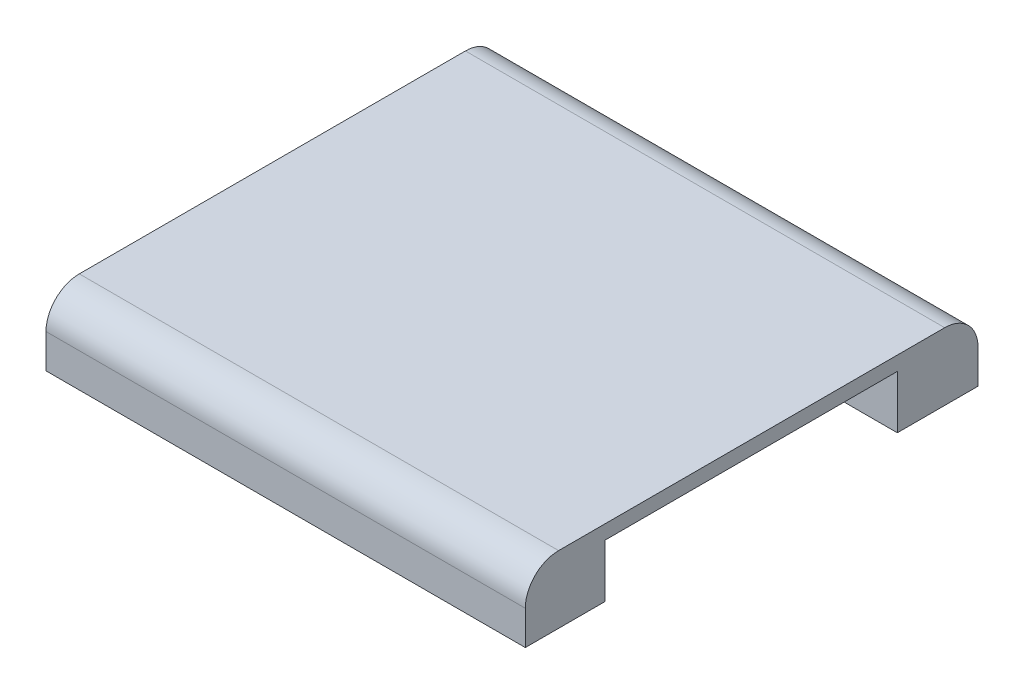
ISO-10303-21;
HEADER;
FILE_DESCRIPTION(('STEP AP214'),'2;1');
FILE_NAME('part.step','',(''),(''),'','','');
FILE_SCHEMA(('AUTOMOTIVE_DESIGN { 1 0 10303 214 1 1 1 1 }'));
ENDSEC;
DATA;
#1=APPLICATION_CONTEXT('core data for automotive mechanical design processes');
#2=APPLICATION_PROTOCOL_DEFINITION('international standard','automotive_design',2000,#1);
#3=PRODUCT_CONTEXT('',#1,'mechanical');
#4=PRODUCT('Part','Part','',(#3));
#5=PRODUCT_RELATED_PRODUCT_CATEGORY('part','',(#4));
#6=PRODUCT_DEFINITION_FORMATION('','',#4);
#7=PRODUCT_DEFINITION_CONTEXT('part definition',#1,'design');
#8=PRODUCT_DEFINITION('design','',#6,#7);
#9=PRODUCT_DEFINITION_SHAPE('','',#8);
#10=(LENGTH_UNIT() NAMED_UNIT(*) SI_UNIT(.MILLI.,.METRE.));
#11=(NAMED_UNIT(*) PLANE_ANGLE_UNIT() SI_UNIT($,.RADIAN.));
#12=(NAMED_UNIT(*) SI_UNIT($,.STERADIAN.) SOLID_ANGLE_UNIT());
#13=UNCERTAINTY_MEASURE_WITH_UNIT(LENGTH_MEASURE(1.E-05),#10,'distance_accuracy_value','');
#14=(GEOMETRIC_REPRESENTATION_CONTEXT(3) GLOBAL_UNCERTAINTY_ASSIGNED_CONTEXT((#13)) GLOBAL_UNIT_ASSIGNED_CONTEXT((#10,
#11,#12)) REPRESENTATION_CONTEXT('',''));
#15=CARTESIAN_POINT('',(0.,0.,0.));
#16=DIRECTION('',(0.,0.,1.));
#17=DIRECTION('',(1.,0.,0.));
#18=AXIS2_PLACEMENT_3D('',#15,#16,#17);
#19=CARTESIAN_POINT('',(0.,0.,1.));
#20=DIRECTION('',(0.,0.,1.));
#21=DIRECTION('',(1.,0.,0.));
#22=AXIS2_PLACEMENT_3D('',#19,#20,#21);
#23=PLANE('',#22);
#24=DIRECTION('',(-1.,0.,0.));
#25=VECTOR('',#24,1.);
#26=CARTESIAN_POINT('',(0.,-0.0578125220072959,1.));
#27=LINE('',#26,#25);
#28=CARTESIAN_POINT('',(17.,-0.0578125220072959,1.));
#29=VERTEX_POINT('',#28);
#30=CARTESIAN_POINT('',(2.52238131463829,-0.0578125220072959,1.));
#31=VERTEX_POINT('',#30);
#32=EDGE_CURVE('E443',#29,#31,#27,.T.);
#33=ORIENTED_EDGE('',*,*,#32,.F.);
#34=DIRECTION('',(0.,1.,0.));
#35=VECTOR('',#34,1.);
#36=CARTESIAN_POINT('',(17.,-5.,1.));
#37=LINE('',#36,#35);
#38=CARTESIAN_POINT('',(17.,4.,1.));
#39=VERTEX_POINT('',#38);
#40=EDGE_CURVE('E331',#29,#39,#37,.T.);
#41=ORIENTED_EDGE('',*,*,#40,.T.);
#42=DIRECTION('',(1.,0.,0.));
#43=VECTOR('',#42,1.);
#44=CARTESIAN_POINT('',(-18.,4.,1.));
#45=LINE('',#44,#43);
#46=CARTESIAN_POINT('',(2.52238131463829,4.,1.));
#47=VERTEX_POINT('',#46);
#48=EDGE_CURVE('E327',#47,#39,#45,.T.);
#49=ORIENTED_EDGE('',*,*,#48,.F.);
#50=DIRECTION('',(0.,1.,0.));
#51=VECTOR('',#50,1.);
#52=CARTESIAN_POINT('',(2.52238131463829,0.,1.));
#53=LINE('',#52,#51);
#54=EDGE_CURVE('E384',#31,#47,#53,.T.);
#55=ORIENTED_EDGE('',*,*,#54,.F.);
#56=EDGE_LOOP('',(#33,#41,#49,#55));
#57=FACE_BOUND('',#56,.T.);
#58=ADVANCED_FACE('F34',(#57),#23,.T.);
#59=CARTESIAN_POINT('',(2.54458171045212,-3.2,0.980815803191426));
#60=DIRECTION('',(0.653837073445968,0.,0.756635368845266));
#61=DIRECTION('',(0.756635368845266,0.,-0.653837073445968));
#62=AXIS2_PLACEMENT_3D('',#59,#60,#61);
#63=PLANE('',#62);
#64=DIRECTION('',(-0.756635368845266,0.,0.653837073445968));
#65=VECTOR('',#64,1.);
#66=CARTESIAN_POINT('',(2.54458171045212,-0.0578125220072959,0.980815803191426));
#67=LINE('',#66,#65);
#68=CARTESIAN_POINT('',(-0.105019187153202,-0.0578125220072959,3.27043556988826));
#69=VERTEX_POINT('',#68);
#70=EDGE_CURVE('E410',#31,#69,#67,.T.);
#71=ORIENTED_EDGE('',*,*,#70,.F.);
#72=ORIENTED_EDGE('',*,*,#54,.T.);
#73=DIRECTION('',(0.756635368845266,0.,-0.653837073445968));
#74=VECTOR('',#73,1.);
#75=CARTESIAN_POINT('',(2.54458171045212,4.,0.980815803191426));
#76=LINE('',#75,#74);
#77=CARTESIAN_POINT('',(-0.105019187153202,4.,3.27043556988826));
#78=VERTEX_POINT('',#77);
#79=EDGE_CURVE('E283',#78,#47,#76,.T.);
#80=ORIENTED_EDGE('',*,*,#79,.F.);
#81=DIRECTION('',(0.,1.,0.));
#82=VECTOR('',#81,1.);
#83=CARTESIAN_POINT('',(-0.105019187153202,-3.2,3.27043556988826));
#84=LINE('',#83,#82);
#85=EDGE_CURVE('E293',#69,#78,#84,.T.);
#86=ORIENTED_EDGE('',*,*,#85,.F.);
#87=EDGE_LOOP('',(#71,#72,#80,#86));
#88=FACE_BOUND('',#87,.T.);
#89=ADVANCED_FACE('F478',(#88),#63,.T.);
#90=DIRECTION('',(-1.,0.,0.));
#91=VECTOR('',#90,1.);
#92=CARTESIAN_POINT('',(0.,-0.0578125220072959,1.));
#93=LINE('',#92,#91);
#94=CARTESIAN_POINT('',(-5.64547851523037,-0.0578125220072959,1.));
#95=VERTEX_POINT('',#94);
#96=CARTESIAN_POINT('',(-17.,-0.0578125220072959,1.));
#97=VERTEX_POINT('',#96);
#98=EDGE_CURVE('E432',#95,#97,#93,.T.);
#99=ORIENTED_EDGE('',*,*,#98,.F.);
#100=DIRECTION('',(0.,-1.,0.));
#101=VECTOR('',#100,1.);
#102=CARTESIAN_POINT('',(-5.64547851523037,0.,1.));
#103=LINE('',#102,#101);
#104=CARTESIAN_POINT('',(-5.64547851523037,4.,1.));
#105=VERTEX_POINT('',#104);
#106=EDGE_CURVE('E381',#105,#95,#103,.T.);
#107=ORIENTED_EDGE('',*,*,#106,.F.);
#108=CARTESIAN_POINT('',(-17.,4.,1.));
#109=VERTEX_POINT('',#108);
#110=EDGE_CURVE('E328',#109,#105,#45,.T.);
#111=ORIENTED_EDGE('',*,*,#110,.F.);
#112=DIRECTION('',(0.,1.,0.));
#113=VECTOR('',#112,1.);
#114=CARTESIAN_POINT('',(-17.,-5.,1.));
#115=LINE('',#114,#113);
#116=EDGE_CURVE('E346',#97,#109,#115,.T.);
#117=ORIENTED_EDGE('',*,*,#116,.F.);
#118=EDGE_LOOP('',(#99,#107,#111,#117));
#119=FACE_BOUND('',#118,.T.);
#120=ADVANCED_FACE('F453',(#119),#23,.T.);
#121=CARTESIAN_POINT('',(-18.,4.,34.));
#122=DIRECTION('',(0.,1.,0.));
#123=DIRECTION('',(0.,0.,1.));
#124=AXIS2_PLACEMENT_3D('',#121,#122,#123);
#125=PLANE('',#124);
#126=DIRECTION('',(1.,0.,0.));
#127=VECTOR('',#126,1.);
#128=CARTESIAN_POINT('',(-0.105019187153202,4.,3.27043556988826));
#129=LINE('',#128,#127);
#130=CARTESIAN_POINT('',(-3.68350976570056,4.,3.27043556988826));
#131=VERTEX_POINT('',#130);
#132=EDGE_CURVE('E284',#131,#78,#129,.T.);
#133=ORIENTED_EDGE('',*,*,#132,.T.);
#134=ORIENTED_EDGE('',*,*,#79,.T.);
#135=ORIENTED_EDGE('',*,*,#48,.T.);
#136=DIRECTION('',(0.,0.,-1.));
#137=VECTOR('',#136,1.);
#138=CARTESIAN_POINT('',(17.,4.,34.));
#139=LINE('',#138,#137);
#140=CARTESIAN_POINT('',(17.,4.,4.95785802597595));
#141=VERTEX_POINT('',#140);
#142=EDGE_CURVE('E345',#141,#39,#139,.T.);
#143=ORIENTED_EDGE('',*,*,#142,.F.);
#144=DIRECTION('',(1.,0.,0.));
#145=VECTOR('',#144,1.);
#146=CARTESIAN_POINT('',(-18.,4.,4.95785802597595));
#147=LINE('',#146,#145);
#148=CARTESIAN_POINT('',(-17.,4.,4.95785802597595));
#149=VERTEX_POINT('',#148);
#150=EDGE_CURVE('E317',#149,#141,#147,.T.);
#151=ORIENTED_EDGE('',*,*,#150,.F.);
#152=DIRECTION('',(0.,0.,-1.));
#153=VECTOR('',#152,1.);
#154=CARTESIAN_POINT('',(-17.,4.,34.));
#155=LINE('',#154,#153);
#156=EDGE_CURVE('E336',#149,#109,#155,.T.);
#157=ORIENTED_EDGE('',*,*,#156,.T.);
#158=ORIENTED_EDGE('',*,*,#110,.T.);
#159=DIRECTION('',(0.653837073445968,0.,0.756635368845266));
#160=VECTOR('',#159,1.);
#161=CARTESIAN_POINT('',(-3.68350976570056,4.,3.27043556988826));
#162=LINE('',#161,#160);
#163=EDGE_CURVE('E288',#105,#131,#162,.T.);
#164=ORIENTED_EDGE('',*,*,#163,.T.);
#165=EDGE_LOOP('',(#133,#134,#135,#143,#151,#157,#158,#164));
#166=FACE_BOUND('',#165,.T.);
#167=ADVANCED_FACE('F461',(#166),#125,.F.);
#168=CARTESIAN_POINT('',(-0.105019187153202,-3.2,3.27043556988826));
#169=DIRECTION('',(0.,0.,1.));
#170=DIRECTION('',(1.,0.,0.));
#171=AXIS2_PLACEMENT_3D('',#168,#169,#170);
#172=PLANE('',#171);
#173=DIRECTION('',(-1.,0.,0.));
#174=VECTOR('',#173,1.);
#175=CARTESIAN_POINT('',(-0.105019187153202,-0.0578125220072959,3.27043556988826));
#176=LINE('',#175,#174);
#177=CARTESIAN_POINT('',(-3.68350976570056,-0.0578125220072959,3.27043556988826));
#178=VERTEX_POINT('',#177);
#179=EDGE_CURVE('E438',#69,#178,#176,.T.);
#180=ORIENTED_EDGE('',*,*,#179,.F.);
#181=ORIENTED_EDGE('',*,*,#85,.T.);
#182=ORIENTED_EDGE('',*,*,#132,.F.);
#183=DIRECTION('',(0.,1.,0.));
#184=VECTOR('',#183,1.);
#185=CARTESIAN_POINT('',(-3.68350976570056,-3.2,3.27043556988826));
#186=LINE('',#185,#184);
#187=EDGE_CURVE('E287',#178,#131,#186,.T.);
#188=ORIENTED_EDGE('',*,*,#187,.F.);
#189=EDGE_LOOP('',(#180,#181,#182,#188));
#190=FACE_BOUND('',#189,.T.);
#191=ADVANCED_FACE('F481',(#190),#172,.T.);
#192=CARTESIAN_POINT('',(-3.68350976570056,-3.2,3.27043556988826));
#193=DIRECTION('',(-0.756635368845266,0.,0.653837073445968));
#194=DIRECTION('',(0.653837073445968,0.,0.756635368845266));
#195=AXIS2_PLACEMENT_3D('',#192,#193,#194);
#196=PLANE('',#195);
#197=DIRECTION('',(-0.653837073445968,0.,-0.756635368845266));
#198=VECTOR('',#197,1.);
#199=CARTESIAN_POINT('',(-3.68350976570056,-0.0578125220072959,3.27043556988826));
#200=LINE('',#199,#198);
#201=EDGE_CURVE('E43',#178,#95,#200,.T.);
#202=ORIENTED_EDGE('',*,*,#201,.F.);
#203=ORIENTED_EDGE('',*,*,#187,.T.);
#204=ORIENTED_EDGE('',*,*,#163,.F.);
#205=ORIENTED_EDGE('',*,*,#106,.T.);
#206=EDGE_LOOP('',(#202,#203,#204,#205));
#207=FACE_BOUND('',#206,.T.);
#208=ADVANCED_FACE('F483',(#207),#196,.T.);
#209=CARTESIAN_POINT('',(-17.,-5.,34.));
#210=DIRECTION('',(-1.,0.,0.));
#211=DIRECTION('',(0.,-1.,0.));
#212=AXIS2_PLACEMENT_3D('',#209,#210,#211);
#213=PLANE('',#212);
#214=DIRECTION('',(0.,1.,0.));
#215=VECTOR('',#214,1.);
#216=CARTESIAN_POINT('',(-17.,-5.,4.95785802597595));
#217=LINE('',#216,#215);
#218=CARTESIAN_POINT('',(-17.,-0.0578125220072959,4.95785802597595));
#219=VERTEX_POINT('',#218);
#220=EDGE_CURVE('E320',#219,#149,#217,.T.);
#221=ORIENTED_EDGE('',*,*,#220,.F.);
#222=DIRECTION('',(0.,0.,-1.));
#223=VECTOR('',#222,1.);
#224=CARTESIAN_POINT('',(-17.,-0.0578125220072959,34.));
#225=LINE('',#224,#223);
#226=EDGE_CURVE('E408',#219,#97,#225,.T.);
#227=ORIENTED_EDGE('',*,*,#226,.T.);
#228=ORIENTED_EDGE('',*,*,#116,.T.);
#229=ORIENTED_EDGE('',*,*,#156,.F.);
#230=EDGE_LOOP('',(#221,#227,#228,#229));
#231=FACE_BOUND('',#230,.T.);
#232=ADVANCED_FACE('F458',(#231),#213,.F.);
#233=CARTESIAN_POINT('',(17.,-5.,34.));
#234=DIRECTION('',(-1.,0.,0.));
#235=DIRECTION('',(0.,0.,1.));
#236=AXIS2_PLACEMENT_3D('',#233,#234,#235);
#237=PLANE('',#236);
#238=DIRECTION('',(0.,0.,-1.));
#239=VECTOR('',#238,1.);
#240=CARTESIAN_POINT('',(17.,-0.0578125220072959,34.));
#241=LINE('',#240,#239);
#242=CARTESIAN_POINT('',(17.,-0.0578125220072959,4.95785802597595));
#243=VERTEX_POINT('',#242);
#244=EDGE_CURVE('E429',#243,#29,#241,.T.);
#245=ORIENTED_EDGE('',*,*,#244,.F.);
#246=DIRECTION('',(0.,1.,0.));
#247=VECTOR('',#246,1.);
#248=CARTESIAN_POINT('',(17.,-5.,4.95785802597595));
#249=LINE('',#248,#247);
#250=EDGE_CURVE('E363',#243,#141,#249,.T.);
#251=ORIENTED_EDGE('',*,*,#250,.T.);
#252=ORIENTED_EDGE('',*,*,#142,.T.);
#253=ORIENTED_EDGE('',*,*,#40,.F.);
#254=EDGE_LOOP('',(#245,#251,#252,#253));
#255=FACE_BOUND('',#254,.T.);
#256=ADVANCED_FACE('F471',(#255),#237,.T.);
#257=CARTESIAN_POINT('',(42.7067172059882,4.9358262277073,4.95785802597595));
#258=DIRECTION('',(0.,0.,1.));
#259=DIRECTION('',(1.,0.,0.));
#260=AXIS2_PLACEMENT_3D('',#257,#258,#259);
#261=PLANE('',#260);
#262=ORIENTED_EDGE('',*,*,#250,.F.);
#263=DIRECTION('',(-1.,0.,0.));
#264=VECTOR('',#263,1.);
#265=CARTESIAN_POINT('',(42.7067172059882,-0.0578125220072959,4.95785802597595));
#266=LINE('',#265,#264);
#267=EDGE_CURVE('E38',#243,#219,#266,.T.);
#268=ORIENTED_EDGE('',*,*,#267,.T.);
#269=ORIENTED_EDGE('',*,*,#220,.T.);
#270=ORIENTED_EDGE('',*,*,#150,.T.);
#271=EDGE_LOOP('',(#262,#268,#269,#270));
#272=FACE_BOUND('',#271,.T.);
#273=ADVANCED_FACE('F467',(#272),#261,.F.);
#274=CARTESIAN_POINT('',(18.,-0.0578125220072959,28.0241501159373));
#275=DIRECTION('',(0.,1.,0.));
#276=DIRECTION('',(0.,0.,1.));
#277=AXIS2_PLACEMENT_3D('',#274,#275,#276);
#278=PLANE('',#277);
#279=DIRECTION('',(1.,0.,0.));
#280=VECTOR('',#279,1.);
#281=CARTESIAN_POINT('',(-40.325568237644,-0.0578125220072959,6.05869530103713));
#282=LINE('',#281,#280);
#283=CARTESIAN_POINT('',(-18.,-0.0578125220072959,6.05869530103713));
#284=VERTEX_POINT('',#283);
#285=CARTESIAN_POINT('',(18.,-0.0578125220072959,6.05869530103713));
#286=VERTEX_POINT('',#285);
#287=EDGE_CURVE('E252',#284,#286,#282,.T.);
#288=ORIENTED_EDGE('',*,*,#287,.F.);
#289=DIRECTION('',(0.,0.,-1.));
#290=VECTOR('',#289,1.);
#291=CARTESIAN_POINT('',(-18.,-0.0578125220072959,34.));
#292=LINE('',#291,#290);
#293=CARTESIAN_POINT('',(-18.,-0.0578125220072959,0.));
#294=VERTEX_POINT('',#293);
#295=EDGE_CURVE('E398',#284,#294,#292,.T.);
#296=ORIENTED_EDGE('',*,*,#295,.T.);
#297=DIRECTION('',(-1.,0.,0.));
#298=VECTOR('',#297,1.);
#299=CARTESIAN_POINT('',(0.,-0.0578125220072959,0.));
#300=LINE('',#299,#298);
#301=CARTESIAN_POINT('',(18.,-0.0578125220072959,0.));
#302=VERTEX_POINT('',#301);
#303=EDGE_CURVE('E403',#302,#294,#300,.T.);
#304=ORIENTED_EDGE('',*,*,#303,.F.);
#305=DIRECTION('',(0.,0.,-1.));
#306=VECTOR('',#305,1.);
#307=CARTESIAN_POINT('',(18.,-0.0578125220072959,34.));
#308=LINE('',#307,#306);
#309=EDGE_CURVE('E405',#286,#302,#308,.T.);
#310=ORIENTED_EDGE('',*,*,#309,.F.);
#311=EDGE_LOOP('',(#288,#296,#304,#310));
#312=FACE_BOUND('',#311,.T.);
#313=ORIENTED_EDGE('',*,*,#267,.F.);
#314=ORIENTED_EDGE('',*,*,#244,.T.);
#315=ORIENTED_EDGE('',*,*,#32,.T.);
#316=ORIENTED_EDGE('',*,*,#70,.T.);
#317=ORIENTED_EDGE('',*,*,#179,.T.);
#318=ORIENTED_EDGE('',*,*,#201,.T.);
#319=ORIENTED_EDGE('',*,*,#98,.T.);
#320=ORIENTED_EDGE('',*,*,#226,.F.);
#321=EDGE_LOOP('',(#313,#314,#315,#316,#317,#318,#319,#320));
#322=FACE_BOUND('',#321,.T.);
#323=ADVANCED_FACE('F36',(#312,#322),#278,.F.);
#324=CARTESIAN_POINT('',(-18.,-0.0578125220072959,34.));
#325=VERTEX_POINT('',#324);
#326=CARTESIAN_POINT('',(-18.,-0.0578125220072959,28.0241501159373));
#327=VERTEX_POINT('',#326);
#328=EDGE_CURVE('E402',#325,#327,#292,.T.);
#329=ORIENTED_EDGE('',*,*,#328,.T.);
#330=DIRECTION('',(1.,0.,0.));
#331=VECTOR('',#330,1.);
#332=CARTESIAN_POINT('',(-40.325568237644,-0.0578125220072959,28.0241501159373));
#333=LINE('',#332,#331);
#334=CARTESIAN_POINT('',(18.,-0.0578125220072959,28.0241501159373));
#335=VERTEX_POINT('',#334);
#336=EDGE_CURVE('E11',#327,#335,#333,.T.);
#337=ORIENTED_EDGE('',*,*,#336,.T.);
#338=CARTESIAN_POINT('',(18.,-0.0578125220072959,34.));
#339=VERTEX_POINT('',#338);
#340=EDGE_CURVE('E51',#339,#335,#308,.T.);
#341=ORIENTED_EDGE('',*,*,#340,.F.);
#342=DIRECTION('',(-1.,0.,0.));
#343=VECTOR('',#342,1.);
#344=CARTESIAN_POINT('',(0.,-0.0578125220072959,34.));
#345=LINE('',#344,#343);
#346=EDGE_CURVE('E401',#339,#325,#345,.T.);
#347=ORIENTED_EDGE('',*,*,#346,.T.);
#348=EDGE_LOOP('',(#329,#337,#341,#347));
#349=FACE_BOUND('',#348,.T.);
#350=CARTESIAN_POINT('',(17.,-0.0578125220072959,33.));
#351=VERTEX_POINT('',#350);
#352=CARTESIAN_POINT('',(17.,-0.0578125220072959,28.926894451086));
#353=VERTEX_POINT('',#352);
#354=EDGE_CURVE('E433',#351,#353,#241,.T.);
#355=ORIENTED_EDGE('',*,*,#354,.T.);
#356=DIRECTION('',(1.,0.,0.));
#357=VECTOR('',#356,1.);
#358=CARTESIAN_POINT('',(42.7067172059882,-0.0578125220072959,28.926894451086));
#359=LINE('',#358,#357);
#360=CARTESIAN_POINT('',(-17.,-0.0578125220072959,28.926894451086));
#361=VERTEX_POINT('',#360);
#362=EDGE_CURVE('E406',#361,#353,#359,.T.);
#363=ORIENTED_EDGE('',*,*,#362,.F.);
#364=CARTESIAN_POINT('',(-17.,-0.0578125220072959,33.));
#365=VERTEX_POINT('',#364);
#366=EDGE_CURVE('E416',#365,#361,#225,.T.);
#367=ORIENTED_EDGE('',*,*,#366,.F.);
#368=DIRECTION('',(-1.,0.,0.));
#369=VECTOR('',#368,1.);
#370=CARTESIAN_POINT('',(0.,-0.0578125220072959,33.));
#371=LINE('',#370,#369);
#372=CARTESIAN_POINT('',(7.80627689891058,-0.0578125220072959,33.));
#373=VERTEX_POINT('',#372);
#374=EDGE_CURVE('E417',#373,#365,#371,.T.);
#375=ORIENTED_EDGE('',*,*,#374,.F.);
#376=DIRECTION('',(-0.707040858821482,0.,0.707172697406356));
#377=VECTOR('',#376,1.);
#378=CARTESIAN_POINT('',(7.80627689891058,-0.0578125220072959,33.));
#379=LINE('',#378,#377);
#380=CARTESIAN_POINT('',(7.83796469042223,-0.0578125220072959,32.9683062998148));
#381=VERTEX_POINT('',#380);
#382=EDGE_CURVE('E397',#381,#373,#379,.T.);
#383=ORIENTED_EDGE('',*,*,#382,.F.);
#384=DIRECTION('',(1.,0.,0.));
#385=VECTOR('',#384,1.);
#386=CARTESIAN_POINT('',(13.9400122350262,-0.0578125220072959,32.9683062998148));
#387=LINE('',#386,#385);
#388=CARTESIAN_POINT('',(4.85968181109299,-0.0578125220072959,32.9683062998148));
#389=VERTEX_POINT('',#388);
#390=EDGE_CURVE('E413',#389,#381,#387,.T.);
#391=ORIENTED_EDGE('',*,*,#390,.F.);
#392=DIRECTION('',(-0.68267317744641,0.,0.73072384167702));
#393=VECTOR('',#392,1.);
#394=CARTESIAN_POINT('',(4.85968181109299,-0.0578125220072959,32.9683062998148));
#395=LINE('',#394,#393);
#396=CARTESIAN_POINT('',(7.40340874838498,-0.0578125220072959,30.2455364866692));
#397=VERTEX_POINT('',#396);
#398=EDGE_CURVE('E420',#397,#389,#395,.T.);
#399=ORIENTED_EDGE('',*,*,#398,.F.);
#400=DIRECTION('',(-1.,0.,0.));
#401=VECTOR('',#400,1.);
#402=CARTESIAN_POINT('',(12.3591776077276,-0.0578125220072959,30.2455364866692));
#403=LINE('',#402,#401);
#404=CARTESIAN_POINT('',(13.9400122350262,-0.0578125220072959,30.2455364866692));
#405=VERTEX_POINT('',#404);
#406=EDGE_CURVE('E423',#405,#397,#403,.T.);
#407=ORIENTED_EDGE('',*,*,#406,.F.);
#408=DIRECTION('',(0.,0.,-1.));
#409=VECTOR('',#408,1.);
#410=CARTESIAN_POINT('',(13.9400122350262,-0.0578125220072959,30.2455364866692));
#411=LINE('',#410,#409);
#412=CARTESIAN_POINT('',(13.9400122350262,-0.0578125220072959,32.9683062998148));
#413=VERTEX_POINT('',#412);
#414=EDGE_CURVE('E422',#413,#405,#411,.T.);
#415=ORIENTED_EDGE('',*,*,#414,.F.);
#416=DIRECTION('',(1.,0.,0.));
#417=VECTOR('',#416,1.);
#418=CARTESIAN_POINT('',(13.9400122350262,-0.0578125220072959,32.9683062998148));
#419=LINE('',#418,#417);
#420=CARTESIAN_POINT('',(11.5237850289689,-0.0578125220072959,32.9683062998148));
#421=VERTEX_POINT('',#420);
#422=EDGE_CURVE('E415',#421,#413,#419,.T.);
#423=ORIENTED_EDGE('',*,*,#422,.F.);
#424=DIRECTION('',(0.,0.,-1.));
#425=VECTOR('',#424,1.);
#426=CARTESIAN_POINT('',(11.5237850289689,-0.0578125220072959,31.9372937490459));
#427=LINE('',#426,#425);
#428=CARTESIAN_POINT('',(11.5237850289689,-0.0578125220072959,33.));
#429=VERTEX_POINT('',#428);
#430=EDGE_CURVE('E412',#429,#421,#427,.T.);
#431=ORIENTED_EDGE('',*,*,#430,.F.);
#432=DIRECTION('',(-1.,0.,0.));
#433=VECTOR('',#432,1.);
#434=CARTESIAN_POINT('',(0.,-0.0578125220072959,33.));
#435=LINE('',#434,#433);
#436=EDGE_CURVE('E419',#351,#429,#435,.T.);
#437=ORIENTED_EDGE('',*,*,#436,.F.);
#438=EDGE_LOOP('',(#355,#363,#367,#375,#383,#391,#399,#407,#415,#423,#431,#437));
#439=FACE_BOUND('',#438,.T.);
#440=ADVANCED_FACE('F497',(#349,#439),#278,.F.);
#441=CARTESIAN_POINT('',(13.9400122350262,-3.2,32.9683062998148));
#442=DIRECTION('',(0.,0.,-1.));
#443=DIRECTION('',(-1.,0.,0.));
#444=AXIS2_PLACEMENT_3D('',#441,#442,#443);
#445=PLANE('',#444);
#446=DIRECTION('',(0.,1.,0.));
#447=VECTOR('',#446,1.);
#448=CARTESIAN_POINT('',(4.85968181109299,-3.2,32.9683062998148));
#449=LINE('',#448,#447);
#450=CARTESIAN_POINT('',(4.85968181109299,4.,32.9683062998148));
#451=VERTEX_POINT('',#450);
#452=EDGE_CURVE('E313',#389,#451,#449,.T.);
#453=ORIENTED_EDGE('',*,*,#452,.F.);
#454=ORIENTED_EDGE('',*,*,#390,.T.);
#455=DIRECTION('',(0.,-1.,0.));
#456=VECTOR('',#455,1.);
#457=CARTESIAN_POINT('',(7.83796469042223,-3.2,32.9683062998148));
#458=LINE('',#457,#456);
#459=CARTESIAN_POINT('',(7.83796469042223,4.,32.9683062998148));
#460=VERTEX_POINT('',#459);
#461=EDGE_CURVE('E270',#460,#381,#458,.T.);
#462=ORIENTED_EDGE('',*,*,#461,.F.);
#463=DIRECTION('',(-1.,0.,0.));
#464=VECTOR('',#463,1.);
#465=CARTESIAN_POINT('',(13.9400122350262,4.,32.9683062998148));
#466=LINE('',#465,#464);
#467=EDGE_CURVE('E295',#460,#451,#466,.T.);
#468=ORIENTED_EDGE('',*,*,#467,.T.);
#469=EDGE_LOOP('',(#453,#454,#462,#468));
#470=FACE_BOUND('',#469,.T.);
#471=ADVANCED_FACE('F494',(#470),#445,.F.);
#472=DIRECTION('',(0.,1.,0.));
#473=VECTOR('',#472,1.);
#474=CARTESIAN_POINT('',(11.5237850289689,-3.2,32.9683062998148));
#475=LINE('',#474,#473);
#476=CARTESIAN_POINT('',(11.5237850289689,4.,32.9683062998148));
#477=VERTEX_POINT('',#476);
#478=EDGE_CURVE('E281',#421,#477,#475,.T.);
#479=ORIENTED_EDGE('',*,*,#478,.F.);
#480=ORIENTED_EDGE('',*,*,#422,.T.);
#481=DIRECTION('',(0.,1.,0.));
#482=VECTOR('',#481,1.);
#483=CARTESIAN_POINT('',(13.9400122350262,-3.2,32.9683062998148));
#484=LINE('',#483,#482);
#485=CARTESIAN_POINT('',(13.9400122350262,4.,32.9683062998148));
#486=VERTEX_POINT('',#485);
#487=EDGE_CURVE('E315',#413,#486,#484,.T.);
#488=ORIENTED_EDGE('',*,*,#487,.T.);
#489=EDGE_CURVE('E297',#486,#477,#466,.T.);
#490=ORIENTED_EDGE('',*,*,#489,.T.);
#491=EDGE_LOOP('',(#479,#480,#488,#490));
#492=FACE_BOUND('',#491,.T.);
#493=ADVANCED_FACE('F496',(#492),#445,.F.);
#494=CARTESIAN_POINT('',(0.,0.,33.));
#495=DIRECTION('',(0.,0.,1.));
#496=DIRECTION('',(1.,0.,0.));
#497=AXIS2_PLACEMENT_3D('',#494,#495,#496);
#498=PLANE('',#497);
#499=DIRECTION('',(0.,1.,0.));
#500=VECTOR('',#499,1.);
#501=CARTESIAN_POINT('',(17.,-5.,33.));
#502=LINE('',#501,#500);
#503=CARTESIAN_POINT('',(17.,4.,33.));
#504=VERTEX_POINT('',#503);
#505=EDGE_CURVE('E340',#351,#504,#502,.T.);
#506=ORIENTED_EDGE('',*,*,#505,.F.);
#507=ORIENTED_EDGE('',*,*,#436,.T.);
#508=DIRECTION('',(0.,-1.,0.));
#509=VECTOR('',#508,1.);
#510=CARTESIAN_POINT('',(11.5237850289689,7.86642099012341,33.));
#511=LINE('',#510,#509);
#512=CARTESIAN_POINT('',(11.5237850289689,4.,33.));
#513=VERTEX_POINT('',#512);
#514=EDGE_CURVE('E274',#513,#429,#511,.T.);
#515=ORIENTED_EDGE('',*,*,#514,.F.);
#516=DIRECTION('',(1.,0.,0.));
#517=VECTOR('',#516,1.);
#518=CARTESIAN_POINT('',(-18.,4.,33.));
#519=LINE('',#518,#517);
#520=EDGE_CURVE('E341',#513,#504,#519,.T.);
#521=ORIENTED_EDGE('',*,*,#520,.T.);
#522=EDGE_LOOP('',(#506,#507,#515,#521));
#523=FACE_BOUND('',#522,.T.);
#524=ADVANCED_FACE('F504',(#523),#498,.F.);
#525=DIRECTION('',(0.,-1.,0.));
#526=VECTOR('',#525,1.);
#527=CARTESIAN_POINT('',(7.80627689891058,7.86642099012341,33.));
#528=LINE('',#527,#526);
#529=CARTESIAN_POINT('',(7.80627689891057,4.,33.));
#530=VERTEX_POINT('',#529);
#531=EDGE_CURVE('E244',#530,#373,#528,.T.);
#532=ORIENTED_EDGE('',*,*,#531,.T.);
#533=ORIENTED_EDGE('',*,*,#374,.T.);
#534=DIRECTION('',(0.,1.,0.));
#535=VECTOR('',#534,1.);
#536=CARTESIAN_POINT('',(-17.,-5.,33.));
#537=LINE('',#536,#535);
#538=CARTESIAN_POINT('',(-17.,4.,33.));
#539=VERTEX_POINT('',#538);
#540=EDGE_CURVE('E348',#365,#539,#537,.T.);
#541=ORIENTED_EDGE('',*,*,#540,.T.);
#542=EDGE_CURVE('E337',#539,#530,#519,.T.);
#543=ORIENTED_EDGE('',*,*,#542,.T.);
#544=EDGE_LOOP('',(#532,#533,#541,#543));
#545=FACE_BOUND('',#544,.T.);
#546=ADVANCED_FACE('F527',(#545),#498,.F.);
#547=DIRECTION('',(0.,0.,-1.));
#548=VECTOR('',#547,1.);
#549=CARTESIAN_POINT('',(11.5237850289689,4.,31.9372937490459));
#550=LINE('',#549,#548);
#551=EDGE_CURVE('E267',#513,#477,#550,.T.);
#552=ORIENTED_EDGE('',*,*,#551,.T.);
#553=ORIENTED_EDGE('',*,*,#489,.F.);
#554=DIRECTION('',(0.,0.,1.));
#555=VECTOR('',#554,1.);
#556=CARTESIAN_POINT('',(13.9400122350262,4.,30.2455364866692));
#557=LINE('',#556,#555);
#558=CARTESIAN_POINT('',(13.9400122350262,4.,30.2455364866692));
#559=VERTEX_POINT('',#558);
#560=EDGE_CURVE('E301',#559,#486,#557,.T.);
#561=ORIENTED_EDGE('',*,*,#560,.F.);
#562=DIRECTION('',(1.,0.,0.));
#563=VECTOR('',#562,1.);
#564=CARTESIAN_POINT('',(12.3591776077276,4.,30.2455364866692));
#565=LINE('',#564,#563);
#566=CARTESIAN_POINT('',(7.40340874838499,4.,30.2455364866692));
#567=VERTEX_POINT('',#566);
#568=EDGE_CURVE('E305',#567,#559,#565,.T.);
#569=ORIENTED_EDGE('',*,*,#568,.F.);
#570=DIRECTION('',(0.68267317744641,0.,-0.73072384167702));
#571=VECTOR('',#570,1.);
#572=CARTESIAN_POINT('',(4.85968181109299,4.,32.9683062998148));
#573=LINE('',#572,#571);
#574=EDGE_CURVE('E300',#451,#567,#573,.T.);
#575=ORIENTED_EDGE('',*,*,#574,.F.);
#576=ORIENTED_EDGE('',*,*,#467,.F.);
#577=DIRECTION('',(-0.707040858821482,0.,0.707172697406356));
#578=VECTOR('',#577,1.);
#579=CARTESIAN_POINT('',(7.80627689891058,4.,33.));
#580=LINE('',#579,#578);
#581=EDGE_CURVE('E271',#460,#530,#580,.T.);
#582=ORIENTED_EDGE('',*,*,#581,.T.);
#583=ORIENTED_EDGE('',*,*,#542,.F.);
#584=CARTESIAN_POINT('',(-17.,4.,28.926894451086));
#585=VERTEX_POINT('',#584);
#586=EDGE_CURVE('E332',#539,#585,#155,.T.);
#587=ORIENTED_EDGE('',*,*,#586,.T.);
#588=DIRECTION('',(-1.,0.,0.));
#589=VECTOR('',#588,1.);
#590=CARTESIAN_POINT('',(-18.,4.,28.926894451086));
#591=LINE('',#590,#589);
#592=CARTESIAN_POINT('',(17.,4.,28.926894451086));
#593=VERTEX_POINT('',#592);
#594=EDGE_CURVE('E322',#593,#585,#591,.T.);
#595=ORIENTED_EDGE('',*,*,#594,.F.);
#596=EDGE_CURVE('E342',#504,#593,#139,.T.);
#597=ORIENTED_EDGE('',*,*,#596,.F.);
#598=ORIENTED_EDGE('',*,*,#520,.F.);
#599=EDGE_LOOP('',(#552,#553,#561,#569,#575,#576,#582,#583,#587,#595,#597,#598));
#600=FACE_BOUND('',#599,.T.);
#601=ADVANCED_FACE('F524',(#600),#125,.F.);
#602=ORIENTED_EDGE('',*,*,#354,.F.);
#603=ORIENTED_EDGE('',*,*,#505,.T.);
#604=ORIENTED_EDGE('',*,*,#596,.T.);
#605=DIRECTION('',(0.,-1.,0.));
#606=VECTOR('',#605,1.);
#607=CARTESIAN_POINT('',(17.,-5.,28.926894451086));
#608=LINE('',#607,#606);
#609=EDGE_CURVE('E367',#593,#353,#608,.T.);
#610=ORIENTED_EDGE('',*,*,#609,.T.);
#611=EDGE_LOOP('',(#602,#603,#604,#610));
#612=FACE_BOUND('',#611,.T.);
#613=ADVANCED_FACE('F526',(#612),#237,.T.);
#614=ORIENTED_EDGE('',*,*,#540,.F.);
#615=ORIENTED_EDGE('',*,*,#366,.T.);
#616=DIRECTION('',(0.,-1.,0.));
#617=VECTOR('',#616,1.);
#618=CARTESIAN_POINT('',(-17.,-5.,28.926894451086));
#619=LINE('',#618,#617);
#620=EDGE_CURVE('E324',#585,#361,#619,.T.);
#621=ORIENTED_EDGE('',*,*,#620,.F.);
#622=ORIENTED_EDGE('',*,*,#586,.F.);
#623=EDGE_LOOP('',(#614,#615,#621,#622));
#624=FACE_BOUND('',#623,.T.);
#625=ADVANCED_FACE('F491',(#624),#213,.F.);
#626=CARTESIAN_POINT('',(42.7067172059882,4.9358262277073,28.926894451086));
#627=DIRECTION('',(0.,0.,-1.));
#628=DIRECTION('',(-1.,0.,0.));
#629=AXIS2_PLACEMENT_3D('',#626,#627,#628);
#630=PLANE('',#629);
#631=ORIENTED_EDGE('',*,*,#620,.T.);
#632=ORIENTED_EDGE('',*,*,#362,.T.);
#633=ORIENTED_EDGE('',*,*,#609,.F.);
#634=ORIENTED_EDGE('',*,*,#594,.T.);
#635=EDGE_LOOP('',(#631,#632,#633,#634));
#636=FACE_BOUND('',#635,.T.);
#637=ADVANCED_FACE('F518',(#636),#630,.F.);
#638=CARTESIAN_POINT('',(4.85968181109299,-3.2,32.9683062998148));
#639=DIRECTION('',(0.73072384167702,0.,0.68267317744641));
#640=DIRECTION('',(0.68267317744641,0.,-0.73072384167702));
#641=AXIS2_PLACEMENT_3D('',#638,#639,#640);
#642=PLANE('',#641);
#643=DIRECTION('',(0.,1.,0.));
#644=VECTOR('',#643,1.);
#645=CARTESIAN_POINT('',(7.40340874838498,-3.2,30.2455364866692));
#646=LINE('',#645,#644);
#647=EDGE_CURVE('E311',#397,#567,#646,.T.);
#648=ORIENTED_EDGE('',*,*,#647,.F.);
#649=ORIENTED_EDGE('',*,*,#398,.T.);
#650=ORIENTED_EDGE('',*,*,#452,.T.);
#651=ORIENTED_EDGE('',*,*,#574,.T.);
#652=EDGE_LOOP('',(#648,#649,#650,#651));
#653=FACE_BOUND('',#652,.T.);
#654=ADVANCED_FACE('F512',(#653),#642,.F.);
#655=CARTESIAN_POINT('',(13.9400122350262,-3.2,30.2455364866692));
#656=DIRECTION('',(-1.,0.,0.));
#657=DIRECTION('',(0.,0.,1.));
#658=AXIS2_PLACEMENT_3D('',#655,#656,#657);
#659=PLANE('',#658);
#660=ORIENTED_EDGE('',*,*,#487,.F.);
#661=ORIENTED_EDGE('',*,*,#414,.T.);
#662=DIRECTION('',(0.,1.,0.));
#663=VECTOR('',#662,1.);
#664=CARTESIAN_POINT('',(13.9400122350262,-3.2,30.2455364866692));
#665=LINE('',#664,#663);
#666=EDGE_CURVE('E304',#405,#559,#665,.T.);
#667=ORIENTED_EDGE('',*,*,#666,.T.);
#668=ORIENTED_EDGE('',*,*,#560,.T.);
#669=EDGE_LOOP('',(#660,#661,#667,#668));
#670=FACE_BOUND('',#669,.T.);
#671=ADVANCED_FACE('F513',(#670),#659,.F.);
#672=CARTESIAN_POINT('',(12.3591776077276,-3.2,30.2455364866692));
#673=DIRECTION('',(0.,0.,1.));
#674=DIRECTION('',(1.,0.,0.));
#675=AXIS2_PLACEMENT_3D('',#672,#673,#674);
#676=PLANE('',#675);
#677=ORIENTED_EDGE('',*,*,#666,.F.);
#678=ORIENTED_EDGE('',*,*,#406,.T.);
#679=ORIENTED_EDGE('',*,*,#647,.T.);
#680=ORIENTED_EDGE('',*,*,#568,.T.);
#681=EDGE_LOOP('',(#677,#678,#679,#680));
#682=FACE_BOUND('',#681,.T.);
#683=ADVANCED_FACE('F516',(#682),#676,.F.);
#684=CARTESIAN_POINT('',(11.5237850289689,7.86642099012341,31.9372937490459));
#685=DIRECTION('',(-1.,0.,0.));
#686=DIRECTION('',(0.,0.,1.));
#687=AXIS2_PLACEMENT_3D('',#684,#685,#686);
#688=PLANE('',#687);
#689=ORIENTED_EDGE('',*,*,#514,.T.);
#690=ORIENTED_EDGE('',*,*,#430,.T.);
#691=ORIENTED_EDGE('',*,*,#478,.T.);
#692=ORIENTED_EDGE('',*,*,#551,.F.);
#693=EDGE_LOOP('',(#689,#690,#691,#692));
#694=FACE_BOUND('',#693,.T.);
#695=ADVANCED_FACE('F589',(#694),#688,.F.);
#696=CARTESIAN_POINT('',(7.80627689891058,7.86642099012341,33.));
#697=DIRECTION('',(0.707172697406356,0.,0.707040858821482));
#698=DIRECTION('',(0.707040858821482,0.,-0.707172697406356));
#699=AXIS2_PLACEMENT_3D('',#696,#697,#698);
#700=PLANE('',#699);
#701=ORIENTED_EDGE('',*,*,#461,.T.);
#702=ORIENTED_EDGE('',*,*,#382,.T.);
#703=ORIENTED_EDGE('',*,*,#531,.F.);
#704=ORIENTED_EDGE('',*,*,#581,.F.);
#705=EDGE_LOOP('',(#701,#702,#703,#704));
#706=FACE_BOUND('',#705,.T.);
#707=ADVANCED_FACE('F508',(#706),#700,.F.);
#708=CARTESIAN_POINT('',(-18.,5.,34.));
#709=DIRECTION('',(0.,1.,0.));
#710=DIRECTION('',(0.,0.,1.));
#711=AXIS2_PLACEMENT_3D('',#708,#709,#710);
#712=PLANE('',#711);
#713=DIRECTION('',(0.,0.,-1.));
#714=VECTOR('',#713,1.);
#715=CARTESIAN_POINT('',(18.,5.,34.));
#716=LINE('',#715,#714);
#717=CARTESIAN_POINT('',(18.,5.,31.5));
#718=VERTEX_POINT('',#717);
#719=CARTESIAN_POINT('',(18.,5.,2.5));
#720=VERTEX_POINT('',#719);
#721=EDGE_CURVE('E357',#718,#720,#716,.T.);
#722=ORIENTED_EDGE('',*,*,#721,.T.);
#723=DIRECTION('',(-1.,0.,0.));
#724=VECTOR('',#723,1.);
#725=CARTESIAN_POINT('',(-18.,5.,2.5));
#726=LINE('',#725,#724);
#727=CARTESIAN_POINT('',(-18.,5.,2.5));
#728=VERTEX_POINT('',#727);
#729=EDGE_CURVE('E386',#720,#728,#726,.T.);
#730=ORIENTED_EDGE('',*,*,#729,.T.);
#731=DIRECTION('',(0.,0.,-1.));
#732=VECTOR('',#731,1.);
#733=CARTESIAN_POINT('',(-18.,5.,34.));
#734=LINE('',#733,#732);
#735=CARTESIAN_POINT('',(-18.,5.,31.5));
#736=VERTEX_POINT('',#735);
#737=EDGE_CURVE('E360',#736,#728,#734,.T.);
#738=ORIENTED_EDGE('',*,*,#737,.F.);
#739=DIRECTION('',(1.,0.,0.));
#740=VECTOR('',#739,1.);
#741=CARTESIAN_POINT('',(-18.,5.,31.5));
#742=LINE('',#741,#740);
#743=EDGE_CURVE('E370',#736,#718,#742,.T.);
#744=ORIENTED_EDGE('',*,*,#743,.T.);
#745=EDGE_LOOP('',(#722,#730,#738,#744));
#746=FACE_BOUND('',#745,.T.);
#747=ADVANCED_FACE('F552',(#746),#712,.T.);
#748=CARTESIAN_POINT('',(-18.,2.5,31.5));
#749=DIRECTION('',(1.,0.,0.));
#750=DIRECTION('',(0.,0.,-1.));
#751=AXIS2_PLACEMENT_3D('',#748,#749,#750);
#752=CYLINDRICAL_SURFACE('',#751,2.5);
#753=ORIENTED_EDGE('',*,*,#743,.F.);
#754=CARTESIAN_POINT('',(-18.,2.5,31.5));
#755=DIRECTION('',(-1.,0.,0.));
#756=DIRECTION('',(0.,-1.,0.));
#757=AXIS2_PLACEMENT_3D('',#754,#755,#756);
#758=CIRCLE('',#757,2.5);
#759=CARTESIAN_POINT('',(-18.,2.5,34.));
#760=VERTEX_POINT('',#759);
#761=EDGE_CURVE('E376',#760,#736,#758,.T.);
#762=ORIENTED_EDGE('',*,*,#761,.F.);
#763=DIRECTION('',(1.,0.,0.));
#764=VECTOR('',#763,1.);
#765=CARTESIAN_POINT('',(0.,2.5,34.));
#766=LINE('',#765,#764);
#767=CARTESIAN_POINT('',(18.,2.5,34.));
#768=VERTEX_POINT('',#767);
#769=EDGE_CURVE('E373',#768,#760,#766,.F.);
#770=ORIENTED_EDGE('',*,*,#769,.F.);
#771=CARTESIAN_POINT('',(18.,2.5,31.5));
#772=DIRECTION('',(-1.,0.,0.));
#773=DIRECTION('',(0.,0.,1.));
#774=AXIS2_PLACEMENT_3D('',#771,#772,#773);
#775=CIRCLE('',#774,2.5);
#776=EDGE_CURVE('E378',#718,#768,#775,.F.);
#777=ORIENTED_EDGE('',*,*,#776,.F.);
#778=EDGE_LOOP('',(#753,#762,#770,#777));
#779=FACE_BOUND('',#778,.T.);
#780=ADVANCED_FACE('F555',(#779),#752,.T.);
#781=CARTESIAN_POINT('',(-18.,2.5,2.5));
#782=DIRECTION('',(1.,0.,0.));
#783=DIRECTION('',(0.,0.,-1.));
#784=AXIS2_PLACEMENT_3D('',#781,#782,#783);
#785=CYLINDRICAL_SURFACE('',#784,2.5);
#786=ORIENTED_EDGE('',*,*,#729,.F.);
#787=CARTESIAN_POINT('',(18.,2.5,2.5));
#788=DIRECTION('',(-1.,0.,0.));
#789=DIRECTION('',(0.,0.,1.));
#790=AXIS2_PLACEMENT_3D('',#787,#788,#789);
#791=CIRCLE('',#790,2.5);
#792=CARTESIAN_POINT('',(18.,2.5,0.));
#793=VERTEX_POINT('',#792);
#794=EDGE_CURVE('E392',#793,#720,#791,.F.);
#795=ORIENTED_EDGE('',*,*,#794,.F.);
#796=DIRECTION('',(-1.,0.,0.));
#797=VECTOR('',#796,1.);
#798=CARTESIAN_POINT('',(-18.,2.5,0.));
#799=LINE('',#798,#797);
#800=CARTESIAN_POINT('',(-18.,2.5,0.));
#801=VERTEX_POINT('',#800);
#802=EDGE_CURVE('E389',#801,#793,#799,.F.);
#803=ORIENTED_EDGE('',*,*,#802,.F.);
#804=CARTESIAN_POINT('',(-18.,2.5,2.5));
#805=DIRECTION('',(-1.,0.,0.));
#806=DIRECTION('',(0.,-1.,0.));
#807=AXIS2_PLACEMENT_3D('',#804,#805,#806);
#808=CIRCLE('',#807,2.5);
#809=EDGE_CURVE('E394',#728,#801,#808,.T.);
#810=ORIENTED_EDGE('',*,*,#809,.F.);
#811=EDGE_LOOP('',(#786,#795,#803,#810));
#812=FACE_BOUND('',#811,.T.);
#813=ADVANCED_FACE('F548',(#812),#785,.T.);
#814=CARTESIAN_POINT('',(-18.,-5.,34.));
#815=DIRECTION('',(-1.,0.,0.));
#816=DIRECTION('',(0.,-1.,0.));
#817=AXIS2_PLACEMENT_3D('',#814,#815,#816);
#818=PLANE('',#817);
#819=ORIENTED_EDGE('',*,*,#328,.F.);
#820=DIRECTION('',(0.,1.,0.));
#821=VECTOR('',#820,1.);
#822=CARTESIAN_POINT('',(-18.,-5.,34.));
#823=LINE('',#822,#821);
#824=EDGE_CURVE('E354',#325,#760,#823,.T.);
#825=ORIENTED_EDGE('',*,*,#824,.T.);
#826=ORIENTED_EDGE('',*,*,#761,.T.);
#827=ORIENTED_EDGE('',*,*,#737,.T.);
#828=ORIENTED_EDGE('',*,*,#809,.T.);
#829=DIRECTION('',(0.,1.,0.));
#830=VECTOR('',#829,1.);
#831=CARTESIAN_POINT('',(-18.,-5.,0.));
#832=LINE('',#831,#830);
#833=EDGE_CURVE('E355',#294,#801,#832,.T.);
#834=ORIENTED_EDGE('',*,*,#833,.F.);
#835=ORIENTED_EDGE('',*,*,#295,.F.);
#836=DIRECTION('',(0.,1.,0.));
#837=VECTOR('',#836,1.);
#838=CARTESIAN_POINT('',(-18.,3.93590653524728,6.05869530103713));
#839=LINE('',#838,#837);
#840=CARTESIAN_POINT('',(-18.,3.93590653524727,6.05869530103713));
#841=VERTEX_POINT('',#840);
#842=EDGE_CURVE('E245',#284,#841,#839,.T.);
#843=ORIENTED_EDGE('',*,*,#842,.T.);
#844=DIRECTION('',(0.,0.,1.));
#845=VECTOR('',#844,1.);
#846=CARTESIAN_POINT('',(-18.,3.93590653524727,28.0241501159373));
#847=LINE('',#846,#845);
#848=CARTESIAN_POINT('',(-18.,3.93590653524727,28.0241501159373));
#849=VERTEX_POINT('',#848);
#850=EDGE_CURVE('E240',#841,#849,#847,.T.);
#851=ORIENTED_EDGE('',*,*,#850,.T.);
#852=DIRECTION('',(0.,-1.,0.));
#853=VECTOR('',#852,1.);
#854=CARTESIAN_POINT('',(-18.,3.93590653524728,28.0241501159373));
#855=LINE('',#854,#853);
#856=EDGE_CURVE('E262',#849,#327,#855,.T.);
#857=ORIENTED_EDGE('',*,*,#856,.T.);
#858=EDGE_LOOP('',(#819,#825,#826,#827,#828,#834,#835,#843,#851,#857));
#859=FACE_BOUND('',#858,.T.);
#860=ADVANCED_FACE('F545',(#859),#818,.T.);
#861=CARTESIAN_POINT('',(-40.325568237644,3.93590653524727,28.0241501159373));
#862=DIRECTION('',(0.,1.,0.));
#863=DIRECTION('',(0.,0.,1.));
#864=AXIS2_PLACEMENT_3D('',#861,#862,#863);
#865=PLANE('',#864);
#866=DIRECTION('',(1.,0.,0.));
#867=VECTOR('',#866,1.);
#868=CARTESIAN_POINT('',(-40.325568237644,3.93590653524727,6.05869530103713));
#869=LINE('',#868,#867);
#870=CARTESIAN_POINT('',(18.,3.93590653524727,6.05869530103713));
#871=VERTEX_POINT('',#870);
#872=EDGE_CURVE('E233',#841,#871,#869,.T.);
#873=ORIENTED_EDGE('',*,*,#872,.T.);
#874=DIRECTION('',(0.,0.,-1.));
#875=VECTOR('',#874,1.);
#876=CARTESIAN_POINT('',(18.,3.93590653524727,28.0241501159373));
#877=LINE('',#876,#875);
#878=CARTESIAN_POINT('',(18.,3.93590653524727,28.0241501159373));
#879=VERTEX_POINT('',#878);
#880=EDGE_CURVE('E238',#879,#871,#877,.T.);
#881=ORIENTED_EDGE('',*,*,#880,.F.);
#882=DIRECTION('',(1.,0.,0.));
#883=VECTOR('',#882,1.);
#884=CARTESIAN_POINT('',(-40.325568237644,3.93590653524727,28.0241501159373));
#885=LINE('',#884,#883);
#886=EDGE_CURVE('E260',#849,#879,#885,.T.);
#887=ORIENTED_EDGE('',*,*,#886,.F.);
#888=ORIENTED_EDGE('',*,*,#850,.F.);
#889=EDGE_LOOP('',(#873,#881,#887,#888));
#890=FACE_BOUND('',#889,.T.);
#891=ADVANCED_FACE('F235',(#890),#865,.F.);
#892=CARTESIAN_POINT('',(18.,-5.,34.));
#893=DIRECTION('',(-1.,0.,0.));
#894=DIRECTION('',(0.,0.,1.));
#895=AXIS2_PLACEMENT_3D('',#892,#893,#894);
#896=PLANE('',#895);
#897=DIRECTION('',(0.,1.,0.));
#898=VECTOR('',#897,1.);
#899=CARTESIAN_POINT('',(18.,-5.,34.));
#900=LINE('',#899,#898);
#901=EDGE_CURVE('E352',#339,#768,#900,.T.);
#902=ORIENTED_EDGE('',*,*,#901,.F.);
#903=ORIENTED_EDGE('',*,*,#340,.T.);
#904=DIRECTION('',(0.,1.,0.));
#905=VECTOR('',#904,1.);
#906=CARTESIAN_POINT('',(18.,3.93590653524727,28.0241501159373));
#907=LINE('',#906,#905);
#908=EDGE_CURVE('E255',#335,#879,#907,.T.);
#909=ORIENTED_EDGE('',*,*,#908,.T.);
#910=ORIENTED_EDGE('',*,*,#880,.T.);
#911=DIRECTION('',(0.,-1.,0.));
#912=VECTOR('',#911,1.);
#913=CARTESIAN_POINT('',(18.,3.93590653524727,6.05869530103713));
#914=LINE('',#913,#912);
#915=EDGE_CURVE('E249',#871,#286,#914,.T.);
#916=ORIENTED_EDGE('',*,*,#915,.T.);
#917=ORIENTED_EDGE('',*,*,#309,.T.);
#918=DIRECTION('',(0.,1.,0.));
#919=VECTOR('',#918,1.);
#920=CARTESIAN_POINT('',(18.,-5.,0.));
#921=LINE('',#920,#919);
#922=EDGE_CURVE('E335',#302,#793,#921,.T.);
#923=ORIENTED_EDGE('',*,*,#922,.T.);
#924=ORIENTED_EDGE('',*,*,#794,.T.);
#925=ORIENTED_EDGE('',*,*,#721,.F.);
#926=ORIENTED_EDGE('',*,*,#776,.T.);
#927=EDGE_LOOP('',(#902,#903,#909,#910,#916,#917,#923,#924,#925,#926));
#928=FACE_BOUND('',#927,.T.);
#929=ADVANCED_FACE('F254',(#928),#896,.F.);
#930=CARTESIAN_POINT('',(-40.325568237644,3.93590653524727,6.05869530103713));
#931=DIRECTION('',(0.,0.,-1.));
#932=DIRECTION('',(-1.,0.,0.));
#933=AXIS2_PLACEMENT_3D('',#930,#931,#932);
#934=PLANE('',#933);
#935=ORIENTED_EDGE('',*,*,#287,.T.);
#936=ORIENTED_EDGE('',*,*,#915,.F.);
#937=ORIENTED_EDGE('',*,*,#872,.F.);
#938=ORIENTED_EDGE('',*,*,#842,.F.);
#939=EDGE_LOOP('',(#935,#936,#937,#938));
#940=FACE_BOUND('',#939,.T.);
#941=ADVANCED_FACE('F250',(#940),#934,.F.);
#942=CARTESIAN_POINT('',(-40.325568237644,3.93590653524727,28.0241501159373));
#943=DIRECTION('',(0.,0.,1.));
#944=DIRECTION('',(1.,0.,0.));
#945=AXIS2_PLACEMENT_3D('',#942,#943,#944);
#946=PLANE('',#945);
#947=ORIENTED_EDGE('',*,*,#886,.T.);
#948=ORIENTED_EDGE('',*,*,#908,.F.);
#949=ORIENTED_EDGE('',*,*,#336,.F.);
#950=ORIENTED_EDGE('',*,*,#856,.F.);
#951=EDGE_LOOP('',(#947,#948,#949,#950));
#952=FACE_BOUND('',#951,.T.);
#953=ADVANCED_FACE('F543',(#952),#946,.F.);
#954=CARTESIAN_POINT('',(0.,0.,0.));
#955=DIRECTION('',(0.,0.,1.));
#956=DIRECTION('',(1.,0.,0.));
#957=AXIS2_PLACEMENT_3D('',#954,#955,#956);
#958=PLANE('',#957);
#959=ORIENTED_EDGE('',*,*,#922,.F.);
#960=ORIENTED_EDGE('',*,*,#303,.T.);
#961=ORIENTED_EDGE('',*,*,#833,.T.);
#962=ORIENTED_EDGE('',*,*,#802,.T.);
#963=EDGE_LOOP('',(#959,#960,#961,#962));
#964=FACE_BOUND('',#963,.T.);
#965=ADVANCED_FACE('F539',(#964),#958,.F.);
#966=CARTESIAN_POINT('',(0.,0.,34.));
#967=DIRECTION('',(0.,0.,1.));
#968=DIRECTION('',(1.,0.,0.));
#969=AXIS2_PLACEMENT_3D('',#966,#967,#968);
#970=PLANE('',#969);
#971=ORIENTED_EDGE('',*,*,#346,.F.);
#972=ORIENTED_EDGE('',*,*,#901,.T.);
#973=ORIENTED_EDGE('',*,*,#769,.T.);
#974=ORIENTED_EDGE('',*,*,#824,.F.);
#975=EDGE_LOOP('',(#971,#972,#973,#974));
#976=FACE_BOUND('',#975,.T.);
#977=ADVANCED_FACE('F507',(#976),#970,.T.);
#978=CLOSED_SHELL('',(#58,#89,#120,#167,#191,#208,#232,#256,#273,#323,#440,#471,#493,#524,#546,
#601,#613,#625,#637,#654,#671,#683,#695,#707,#747,#780,#813,#860,#891,#929,#941,#953,#965,#977));
#979=MANIFOLD_SOLID_BREP('B2',#978);
#980=ADVANCED_BREP_SHAPE_REPRESENTATION('',(#18,#979),#14);
#981=SHAPE_DEFINITION_REPRESENTATION(#9,#980);
ENDSEC;
END-ISO-10303-21;
